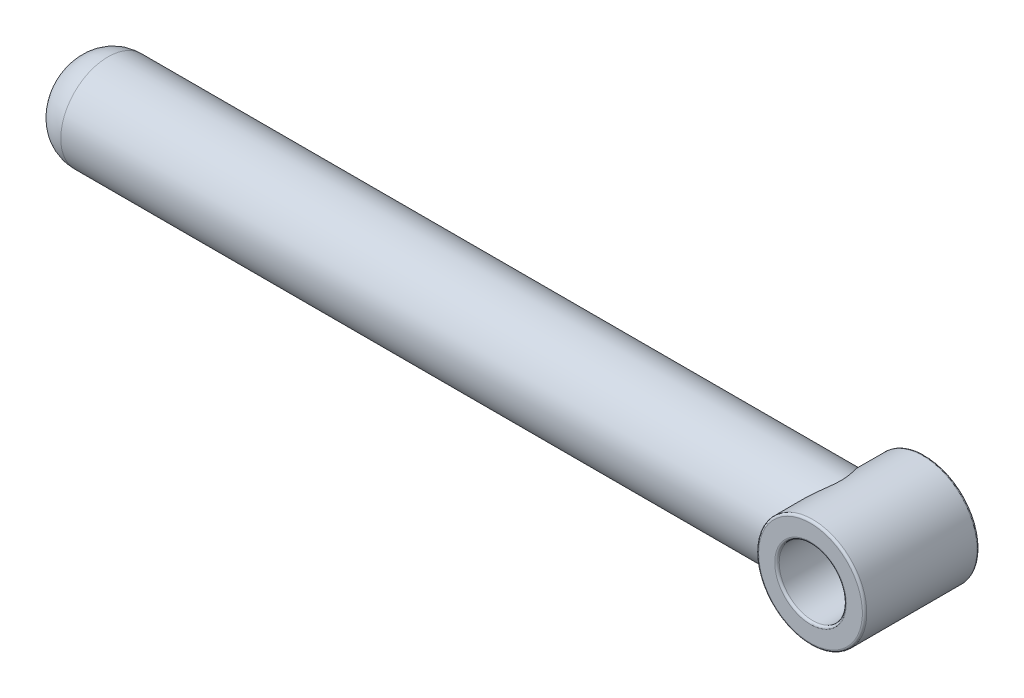
ISO-10303-21;
HEADER;
FILE_DESCRIPTION(('STEP AP214'),'2;1');
FILE_NAME('part.step','',(''),(''),'','','');
FILE_SCHEMA(('AUTOMOTIVE_DESIGN { 1 0 10303 214 1 1 1 1 }'));
ENDSEC;
DATA;
#1=APPLICATION_CONTEXT('core data for automotive mechanical design processes');
#2=APPLICATION_PROTOCOL_DEFINITION('international standard','automotive_design',2000,#1);
#3=PRODUCT_CONTEXT('',#1,'mechanical');
#4=PRODUCT('Part','Part','',(#3));
#5=PRODUCT_RELATED_PRODUCT_CATEGORY('part','',(#4));
#6=PRODUCT_DEFINITION_FORMATION('','',#4);
#7=PRODUCT_DEFINITION_CONTEXT('part definition',#1,'design');
#8=PRODUCT_DEFINITION('design','',#6,#7);
#9=PRODUCT_DEFINITION_SHAPE('','',#8);
#10=(LENGTH_UNIT() NAMED_UNIT(*) SI_UNIT(.MILLI.,.METRE.));
#11=(NAMED_UNIT(*) PLANE_ANGLE_UNIT() SI_UNIT($,.RADIAN.));
#12=(NAMED_UNIT(*) SI_UNIT($,.STERADIAN.) SOLID_ANGLE_UNIT());
#13=UNCERTAINTY_MEASURE_WITH_UNIT(LENGTH_MEASURE(1.E-05),#10,'distance_accuracy_value','');
#14=(GEOMETRIC_REPRESENTATION_CONTEXT(3) GLOBAL_UNCERTAINTY_ASSIGNED_CONTEXT((#13)) GLOBAL_UNIT_ASSIGNED_CONTEXT((#10,
#11,#12)) REPRESENTATION_CONTEXT('',''));
#15=CARTESIAN_POINT('',(0.,0.,0.));
#16=DIRECTION('',(0.,0.,1.));
#17=DIRECTION('',(1.,0.,0.));
#18=AXIS2_PLACEMENT_3D('',#15,#16,#17);
#19=CARTESIAN_POINT('',(0.,0.,25.65));
#20=DIRECTION('',(0.,0.,-1.));
#21=DIRECTION('',(1.,0.,0.));
#22=AXIS2_PLACEMENT_3D('',#19,#20,#21);
#23=CYLINDRICAL_SURFACE('',#22,15.);
#24=CARTESIAN_POINT('',(0.,0.,24.65));
#25=DIRECTION('',(0.,0.,-1.));
#26=DIRECTION('',(-1.,0.,0.));
#27=AXIS2_PLACEMENT_3D('',#24,#25,#26);
#28=CIRCLE('',#27,15.);
#29=CARTESIAN_POINT('',(15.,0.,24.65));
#30=VERTEX_POINT('',#29);
#31=CARTESIAN_POINT('',(-15.,0.,24.65));
#32=VERTEX_POINT('',#31);
#33=EDGE_CURVE('E188',#30,#32,#28,.T.);
#34=ORIENTED_EDGE('',*,*,#33,.F.);
#35=CARTESIAN_POINT('',(0.,0.,24.65));
#36=DIRECTION('',(0.,0.,-1.));
#37=DIRECTION('',(-1.,0.,0.));
#38=AXIS2_PLACEMENT_3D('',#35,#36,#37);
#39=CIRCLE('',#38,15.);
#40=EDGE_CURVE('E164',#32,#30,#39,.T.);
#41=ORIENTED_EDGE('',*,*,#40,.F.);
#42=DIRECTION('',(0.,0.,-1.));
#43=VECTOR('',#42,1.);
#44=CARTESIAN_POINT('',(-15.,0.,25.65));
#45=LINE('',#44,#43);
#46=CARTESIAN_POINT('',(-15.,0.,-24.65));
#47=VERTEX_POINT('',#46);
#48=EDGE_CURVE('E158',#32,#47,#45,.T.);
#49=ORIENTED_EDGE('',*,*,#48,.T.);
#50=CARTESIAN_POINT('',(0.,0.,-24.65));
#51=DIRECTION('',(0.,0.,1.));
#52=DIRECTION('',(-1.,0.,0.));
#53=AXIS2_PLACEMENT_3D('',#50,#51,#52);
#54=CIRCLE('',#53,15.);
#55=EDGE_CURVE('E171',#47,#47,#54,.T.);
#56=ORIENTED_EDGE('',*,*,#55,.F.);
#57=ORIENTED_EDGE('',*,*,#48,.F.);
#58=EDGE_LOOP('',(#34,#41,#49,#56,#57));
#59=FACE_BOUND('',#58,.T.);
#60=ADVANCED_FACE('F40',(#59),#23,.F.);
#61=CARTESIAN_POINT('',(0.,0.,-24.65));
#62=DIRECTION('',(0.,0.,1.));
#63=DIRECTION('',(1.,0.,0.));
#64=AXIS2_PLACEMENT_3D('',#61,#62,#63);
#65=TOROIDAL_SURFACE('',#64,16.,1.);
#66=CARTESIAN_POINT('',(0.,0.,-25.65));
#67=DIRECTION('',(0.,0.,-1.));
#68=DIRECTION('',(-1.,0.,0.));
#69=AXIS2_PLACEMENT_3D('',#66,#67,#68);
#70=CIRCLE('',#69,16.);
#71=CARTESIAN_POINT('',(-16.,0.,-25.65));
#72=VERTEX_POINT('',#71);
#73=EDGE_CURVE('E172',#72,#72,#70,.T.);
#74=ORIENTED_EDGE('',*,*,#73,.T.);
#75=CARTESIAN_POINT('',(-16.,0.,-24.65));
#76=DIRECTION('',(0.,-1.,0.));
#77=DIRECTION('',(-1.,0.,0.));
#78=AXIS2_PLACEMENT_3D('',#75,#76,#77);
#79=CIRCLE('',#78,1.);
#80=EDGE_CURVE('E168',#72,#47,#79,.T.);
#81=ORIENTED_EDGE('',*,*,#80,.T.);
#82=ORIENTED_EDGE('',*,*,#55,.T.);
#83=ORIENTED_EDGE('',*,*,#80,.F.);
#84=EDGE_LOOP('',(#74,#81,#82,#83));
#85=FACE_BOUND('',#84,.T.);
#86=ADVANCED_FACE('F212',(#85),#65,.T.);
#87=CARTESIAN_POINT('',(0.,0.,24.65));
#88=DIRECTION('',(0.,0.,-1.));
#89=DIRECTION('',(-1.,0.,0.));
#90=AXIS2_PLACEMENT_3D('',#87,#88,#89);
#91=TOROIDAL_SURFACE('',#90,16.,1.);
#92=CARTESIAN_POINT('',(0.,0.,25.65));
#93=DIRECTION('',(0.,0.,1.));
#94=DIRECTION('',(-1.,0.,0.));
#95=AXIS2_PLACEMENT_3D('',#92,#93,#94);
#96=CIRCLE('',#95,16.);
#97=CARTESIAN_POINT('',(16.,0.,25.65));
#98=VERTEX_POINT('',#97);
#99=EDGE_CURVE('E157',#98,#98,#96,.T.);
#100=ORIENTED_EDGE('',*,*,#99,.T.);
#101=CARTESIAN_POINT('',(16.,0.,24.65));
#102=DIRECTION('',(0.,-1.,0.));
#103=DIRECTION('',(1.,0.,0.));
#104=AXIS2_PLACEMENT_3D('',#101,#102,#103);
#105=CIRCLE('',#104,1.);
#106=EDGE_CURVE('E165',#98,#30,#105,.T.);
#107=ORIENTED_EDGE('',*,*,#106,.T.);
#108=ORIENTED_EDGE('',*,*,#33,.T.);
#109=ORIENTED_EDGE('',*,*,#40,.T.);
#110=ORIENTED_EDGE('',*,*,#106,.F.);
#111=EDGE_LOOP('',(#100,#107,#108,#109,#110));
#112=FACE_BOUND('',#111,.T.);
#113=ADVANCED_FACE('F218',(#112),#91,.T.);
#114=CARTESIAN_POINT('',(0.,0.,-25.65));
#115=DIRECTION('',(0.,0.,1.));
#116=DIRECTION('',(1.,0.,0.));
#117=AXIS2_PLACEMENT_3D('',#114,#115,#116);
#118=PLANE('',#117);
#119=ORIENTED_EDGE('',*,*,#73,.F.);
#120=EDGE_LOOP('',(#119));
#121=FACE_BOUND('',#120,.T.);
#122=CARTESIAN_POINT('',(0.,0.,-25.65));
#123=DIRECTION('',(0.,0.,1.));
#124=DIRECTION('',(-1.,0.,0.));
#125=AXIS2_PLACEMENT_3D('',#122,#123,#124);
#126=CIRCLE('',#125,23.19);
#127=CARTESIAN_POINT('',(23.19,0.,-25.65));
#128=VERTEX_POINT('',#127);
#129=EDGE_CURVE('E154',#128,#128,#126,.T.);
#130=ORIENTED_EDGE('',*,*,#129,.F.);
#131=EDGE_LOOP('',(#130));
#132=FACE_BOUND('',#131,.T.);
#133=ADVANCED_FACE('F226',(#121,#132),#118,.F.);
#134=CARTESIAN_POINT('',(0.,0.,25.65));
#135=DIRECTION('',(0.,0.,1.));
#136=DIRECTION('',(1.,0.,0.));
#137=AXIS2_PLACEMENT_3D('',#134,#135,#136);
#138=PLANE('',#137);
#139=ORIENTED_EDGE('',*,*,#99,.F.);
#140=EDGE_LOOP('',(#139));
#141=FACE_BOUND('',#140,.T.);
#142=CARTESIAN_POINT('',(0.,0.,25.65));
#143=DIRECTION('',(0.,0.,-1.));
#144=DIRECTION('',(-1.,0.,0.));
#145=AXIS2_PLACEMENT_3D('',#142,#143,#144);
#146=CIRCLE('',#145,23.19);
#147=CARTESIAN_POINT('',(-23.19,0.,25.65));
#148=VERTEX_POINT('',#147);
#149=EDGE_CURVE('E167',#148,#148,#146,.T.);
#150=ORIENTED_EDGE('',*,*,#149,.F.);
#151=EDGE_LOOP('',(#150));
#152=FACE_BOUND('',#151,.T.);
#153=ADVANCED_FACE('F137',(#141,#152),#138,.T.);
#154=CARTESIAN_POINT('',(0.,0.,-24.65));
#155=DIRECTION('',(0.,0.,-1.));
#156=DIRECTION('',(-1.,0.,0.));
#157=AXIS2_PLACEMENT_3D('',#154,#155,#156);
#158=TOROIDAL_SURFACE('',#157,23.19,1.);
#159=ORIENTED_EDGE('',*,*,#129,.T.);
#160=CARTESIAN_POINT('',(23.19,0.,-24.65));
#161=DIRECTION('',(0.,-1.,0.));
#162=DIRECTION('',(1.,0.,0.));
#163=AXIS2_PLACEMENT_3D('',#160,#161,#162);
#164=CIRCLE('',#163,1.);
#165=CARTESIAN_POINT('',(24.19,0.,-24.65));
#166=VERTEX_POINT('',#165);
#167=EDGE_CURVE('E144',#128,#166,#164,.T.);
#168=ORIENTED_EDGE('',*,*,#167,.T.);
#169=CARTESIAN_POINT('',(0.,0.,-24.65));
#170=DIRECTION('',(0.,0.,-1.));
#171=DIRECTION('',(-1.,0.,0.));
#172=AXIS2_PLACEMENT_3D('',#169,#170,#171);
#173=CIRCLE('',#172,24.19);
#174=CARTESIAN_POINT('',(-24.19,0.,-24.65));
#175=VERTEX_POINT('',#174);
#176=EDGE_CURVE('E148',#166,#175,#173,.T.);
#177=ORIENTED_EDGE('',*,*,#176,.T.);
#178=CARTESIAN_POINT('',(0.,0.,-24.65));
#179=DIRECTION('',(0.,0.,-1.));
#180=DIRECTION('',(-1.,0.,0.));
#181=AXIS2_PLACEMENT_3D('',#178,#179,#180);
#182=CIRCLE('',#181,24.19);
#183=EDGE_CURVE('E145',#175,#166,#182,.T.);
#184=ORIENTED_EDGE('',*,*,#183,.T.);
#185=ORIENTED_EDGE('',*,*,#167,.F.);
#186=EDGE_LOOP('',(#159,#168,#177,#184,#185));
#187=FACE_BOUND('',#186,.T.);
#188=ADVANCED_FACE('F230',(#187),#158,.T.);
#189=CARTESIAN_POINT('',(0.,0.,24.65));
#190=DIRECTION('',(0.,0.,1.));
#191=DIRECTION('',(1.,0.,0.));
#192=AXIS2_PLACEMENT_3D('',#189,#190,#191);
#193=TOROIDAL_SURFACE('',#192,23.19,1.);
#194=ORIENTED_EDGE('',*,*,#149,.T.);
#195=CARTESIAN_POINT('',(-23.19,0.,24.65));
#196=DIRECTION('',(0.,-1.,0.));
#197=DIRECTION('',(-1.,0.,0.));
#198=AXIS2_PLACEMENT_3D('',#195,#196,#197);
#199=CIRCLE('',#198,1.);
#200=CARTESIAN_POINT('',(-24.19,0.,24.65));
#201=VERTEX_POINT('',#200);
#202=EDGE_CURVE('E153',#148,#201,#199,.T.);
#203=ORIENTED_EDGE('',*,*,#202,.T.);
#204=CARTESIAN_POINT('',(0.,0.,24.65));
#205=DIRECTION('',(0.,0.,1.));
#206=DIRECTION('',(-1.,0.,0.));
#207=AXIS2_PLACEMENT_3D('',#204,#205,#206);
#208=CIRCLE('',#207,24.19);
#209=EDGE_CURVE('E118',#201,#201,#208,.T.);
#210=ORIENTED_EDGE('',*,*,#209,.T.);
#211=ORIENTED_EDGE('',*,*,#202,.F.);
#212=EDGE_LOOP('',(#194,#203,#210,#211));
#213=FACE_BOUND('',#212,.T.);
#214=ADVANCED_FACE('F136',(#213),#193,.T.);
#215=CARTESIAN_POINT('',(0.,0.,0.));
#216=DIRECTION('',(0.,0.,1.));
#217=DIRECTION('',(1.,0.,0.));
#218=AXIS2_PLACEMENT_3D('',#215,#216,#217);
#219=CYLINDRICAL_SURFACE('',#218,24.19);
#220=ORIENTED_EDGE('',*,*,#209,.F.);
#221=DIRECTION('',(0.,0.,-1.));
#222=VECTOR('',#221,1.);
#223=CARTESIAN_POINT('',(-24.19,0.,0.));
#224=LINE('',#223,#222);
#225=CARTESIAN_POINT('',(-24.19,0.,21.1));
#226=VERTEX_POINT('',#225);
#227=EDGE_CURVE('E117',#201,#226,#224,.T.);
#228=ORIENTED_EDGE('',*,*,#227,.T.);
#229=CARTESIAN_POINT('',(-24.19,0.,21.1));
#230=CARTESIAN_POINT('',(-24.1900076701048,-0.248320968132283,21.1000074174944));
#231=CARTESIAN_POINT('',(-24.1861764782467,-0.496637238632777,21.0956165045089));
#232=CARTESIAN_POINT('',(-24.1708936377932,-0.992714902971529,21.0780936738256));
#233=CARTESIAN_POINT('',(-24.1594423501102,-1.24047632253171,21.0649621701104));
#234=CARTESIAN_POINT('',(-24.1289874404954,-1.73474608541718,21.030026268484));
#235=CARTESIAN_POINT('',(-24.1099892113466,-1.98125519648686,21.0082280634877));
#236=CARTESIAN_POINT('',(-24.0645584738644,-2.47265941043764,20.9560739642434));
#237=CARTESIAN_POINT('',(-24.0381259186053,-2.71755450312103,20.9257180159787));
#238=CARTESIAN_POINT('',(-23.948363615689,-3.44518890236064,20.822564403275));
#239=CARTESIAN_POINT('',(-23.8743140231388,-3.9249505358196,20.7373889975156));
#240=CARTESIAN_POINT('',(-23.6990678789315,-4.87264768542594,20.5353897506526));
#241=CARTESIAN_POINT('',(-23.5978677486705,-5.34058163371065,20.4185617375254));
#242=CARTESIAN_POINT('',(-23.3706381072294,-6.26044674393306,20.1555204131199));
#243=CARTESIAN_POINT('',(-23.2446769348148,-6.71241800018634,20.0093879582214));
#244=CARTESIAN_POINT('',(-22.9700197322245,-7.59933283506647,19.6896521816409));
#245=CARTESIAN_POINT('',(-22.8213244176979,-8.03427694915024,19.5160497246822));
#246=CARTESIAN_POINT('',(-22.5032973905389,-8.88621532034767,19.143191629847));
#247=CARTESIAN_POINT('',(-22.3339286334588,-9.30317548867582,18.9438899046915));
#248=CARTESIAN_POINT('',(-21.9771879633171,-10.1171578243615,18.5219699419594));
#249=CARTESIAN_POINT('',(-21.7898120729567,-10.5141755573415,18.2993465522623));
#250=CARTESIAN_POINT('',(-21.324257277755,-11.4364323156889,17.7428654530749));
#251=CARTESIAN_POINT('',(-21.0389014409622,-11.9521605883574,17.3991903785285));
#252=CARTESIAN_POINT('',(-20.4444089279874,-12.9428059911423,16.6754429899315));
#253=CARTESIAN_POINT('',(-20.1352637345215,-13.4177083743507,16.2953576278975));
#254=CARTESIAN_POINT('',(-19.4985663666644,-14.3272715753217,15.5017505573226));
#255=CARTESIAN_POINT('',(-19.1709804131946,-14.7618544104225,15.0881668369539));
#256=CARTESIAN_POINT('',(-18.5038472366338,-15.5899455622577,14.230909519692));
#257=CARTESIAN_POINT('',(-18.1643016190706,-15.9834593644168,13.7872399543366));
#258=CARTESIAN_POINT('',(-17.4720315220713,-16.7377305448607,12.861660363556));
#259=CARTESIAN_POINT('',(-17.1191800774178,-17.0976241965796,12.3791420322353));
#260=CARTESIAN_POINT('',(-16.4143599649407,-17.7753752772202,11.3845678594015));
#261=CARTESIAN_POINT('',(-16.0623916085761,-18.0932194912872,10.8725028045217));
#262=CARTESIAN_POINT('',(-15.3684112431481,-18.686245335686,9.8183397851733));
#263=CARTESIAN_POINT('',(-15.0263909817822,-18.9614631963217,9.27626786300871));
#264=CARTESIAN_POINT('',(-14.5296981442599,-19.3413444030053,8.4389618916139));
#265=CARTESIAN_POINT('',(-14.3669007997345,-19.4624507578499,8.15591088026673));
#266=CARTESIAN_POINT('',(-14.0485859854916,-19.6934493179608,7.58116283971085));
#267=CARTESIAN_POINT('',(-13.8930696083871,-19.8033398430331,7.289464523509));
#268=CARTESIAN_POINT('',(-13.5781696608457,-20.0207191999087,6.67066099149476));
#269=CARTESIAN_POINT('',(-13.4196761030927,-20.1271216734422,6.34271673386055));
#270=CARTESIAN_POINT('',(-13.1176324736237,-20.3252658151019,5.67578344350614));
#271=CARTESIAN_POINT('',(-12.9740769930655,-20.4170127962348,5.33679846724037));
#272=CARTESIAN_POINT('',(-12.7067939063027,-20.5844173058153,4.64932856778054));
#273=CARTESIAN_POINT('',(-12.5829652425833,-20.660157533051,4.30090351800552));
#274=CARTESIAN_POINT('',(-12.3590388411187,-20.7948883871331,3.59334552088489));
#275=CARTESIAN_POINT('',(-12.2589310059437,-20.8538861429988,3.23421720323808));
#276=CARTESIAN_POINT('',(-12.1183119928582,-20.9357741577232,2.63790056974152));
#277=CARTESIAN_POINT('',(-12.0693260926978,-20.964013891291,2.40342347508946));
#278=CARTESIAN_POINT('',(-11.9842581356231,-21.0127592800554,1.93137918854403));
#279=CARTESIAN_POINT('',(-11.9481725670612,-21.0332670400846,1.69381285586061));
#280=CARTESIAN_POINT('',(-11.8896384898135,-21.0664142579288,1.21425144041929));
#281=CARTESIAN_POINT('',(-11.8673164097513,-21.0789807946837,0.972235734233318));
#282=CARTESIAN_POINT('',(-11.8373932556302,-21.0957881947916,0.486825990604983));
#283=CARTESIAN_POINT('',(-11.8298035708275,-21.1000226168242,0.243431032556692));
#284=CARTESIAN_POINT('',(-11.8298816562128,-21.1,0.));
#285=B_SPLINE_CURVE_WITH_KNOTS('',3,(#229,#230,#231,#232,#233,#234,#235,#236,#237,#238,#239,
#240,#241,#242,#243,#244,#245,#246,#247,#248,#249,#250,#251,#252,#253,#254,#255,#256,#257,#258,
#259,#260,#261,#262,#263,#264,#265,#266,#267,#268,#269,#270,#271,#272,#273,#274,#275,#276,#277,
#278,#279,#280,#281,#282,#283,#284),.UNSPECIFIED.,.F.,.F.,(4,2,2,2,2,2,2,2,2,2,2,2,2,2,2,2,2,2,
2,2,2,2,2,2,2,2,2,4),(0.,0.744886193736472,1.4897371097654,2.23405673577629,2.97838106005382,
4.45480094341388,5.9314155234577,7.40401056254295,8.87655925529222,10.3517864288871,
11.8273401932679,13.8712148347762,15.9158246784911,17.9643100066432,20.0125213757813,
22.1038408208869,24.1958159504495,26.2860031293403,27.3305023728023,28.3751578591476,
29.5128906002318,30.6502099421768,31.7815013515561,32.9123103267042,33.6354776414684,
34.358447949983,35.0879640606083,35.8180439181232),.UNSPECIFIED.);
#286=CARTESIAN_POINT('',(-11.8298816562128,-21.1,0.));
#287=VERTEX_POINT('',#286);
#288=EDGE_CURVE('E103',#226,#287,#285,.T.);
#289=ORIENTED_EDGE('',*,*,#288,.T.);
#290=CARTESIAN_POINT('',(-11.8298816562128,-21.1,0.));
#291=CARTESIAN_POINT('',(-11.8298677813332,-21.1000033989896,-0.17293605594265));
#292=CARTESIAN_POINT('',(-11.8336758390667,-21.0978732141805,-0.345841823355138));
#293=CARTESIAN_POINT('',(-11.848803683265,-21.0893827255771,-0.691190616769087));
#294=CARTESIAN_POINT('',(-11.8601221404638,-21.0830231703389,-0.863633719235866));
#295=CARTESIAN_POINT('',(-11.9050713794334,-21.0576974870929,-1.37889064724477));
#296=CARTESIAN_POINT('',(-11.9496973771575,-21.0324839358711,-1.7205073976675));
#297=CARTESIAN_POINT('',(-12.0647949874141,-20.9666655831007,-2.39184798807697));
#298=CARTESIAN_POINT('',(-12.134827796819,-20.926321720971,-2.72167506046684));
#299=CARTESIAN_POINT('',(-12.2974912197511,-20.8311469218922,-3.37371767687989));
#300=CARTESIAN_POINT('',(-12.3901364665806,-20.7763066018603,-3.69592814323166));
#301=CARTESIAN_POINT('',(-12.6402759596416,-20.6254525179716,-4.4744777592874));
#302=CARTESIAN_POINT('',(-12.8082028322725,-20.52201091161,-4.92602189286902));
#303=CARTESIAN_POINT('',(-13.1734965103912,-20.2894543799745,-5.81009942665675));
#304=CARTESIAN_POINT('',(-13.3708772857459,-20.160327262436,-6.24262367909176));
#305=CARTESIAN_POINT('',(-13.7884830816303,-19.8770746281644,-7.0932852279874));
#306=CARTESIAN_POINT('',(-14.0089025362996,-19.7227289090519,-7.51125242177561));
#307=CARTESIAN_POINT('',(-14.4642666963267,-19.3912460085883,-8.32973764019114));
#308=CARTESIAN_POINT('',(-14.699210578204,-19.2141101187398,-8.73025665187417));
#309=CARTESIAN_POINT('',(-15.1275768903385,-18.8777694912776,-9.43171634511264));
#310=CARTESIAN_POINT('',(-15.3192326161982,-18.7227343201866,-9.73575469132363));
#311=CARTESIAN_POINT('',(-15.7063204202098,-18.3992195454616,-10.3341367183184));
#312=CARTESIAN_POINT('',(-15.9017528750649,-18.2307385954018,-10.6284794240257));
#313=CARTESIAN_POINT('',(-16.4911999990432,-17.7051758009339,-11.4976393630295));
#314=CARTESIAN_POINT('',(-16.8882718000003,-17.3280454856964,-12.0584399493888));
#315=CARTESIAN_POINT('',(-17.6778888817611,-16.5216950663067,-13.1414622031544));
#316=CARTESIAN_POINT('',(-18.0704432606128,-16.0926132373122,-13.6637805775774));
#317=CARTESIAN_POINT('',(-18.8426477444112,-15.1811475315845,-14.6698017519765));
#318=CARTESIAN_POINT('',(-19.2223035080669,-14.6987874337587,-15.1535216143486));
#319=CARTESIAN_POINT('',(-19.8754783600573,-13.7969759434857,-15.9729363260533));
#320=CARTESIAN_POINT('',(-20.1533884037625,-13.3884251329035,-16.3171569239837));
#321=CARTESIAN_POINT('',(-20.6923702608565,-12.5393283199989,-16.9783623073685));
#322=CARTESIAN_POINT('',(-20.9534424269593,-12.0987829882977,-17.2953476633835));
#323=CARTESIAN_POINT('',(-21.4543684652926,-11.1864478629128,-17.8989419976337));
#324=CARTESIAN_POINT('',(-21.6942416020075,-10.7146871323348,-18.1855786030193));
#325=CARTESIAN_POINT('',(-22.0349698071709,-9.98440803620929,-18.5902950239187));
#326=CARTESIAN_POINT('',(-22.1453603398835,-9.73722221902826,-18.7209878945879));
#327=CARTESIAN_POINT('',(-22.3592921241855,-9.23539776495859,-18.9735699480172));
#328=CARTESIAN_POINT('',(-22.4628316000655,-8.98075722037373,-19.095456849125));
#329=CARTESIAN_POINT('',(-22.725159355381,-8.30218271283175,-19.4035253149342));
#330=CARTESIAN_POINT('',(-22.8778239401849,-7.87232972171538,-19.582030743482));
#331=CARTESIAN_POINT('',(-23.1610063681852,-6.99543755652182,-19.9121396638572));
#332=CARTESIAN_POINT('',(-23.2915286255309,-6.54840182972915,-20.0637485178856));
#333=CARTESIAN_POINT('',(-23.5280142010858,-5.63990446681989,-20.3378008397087));
#334=CARTESIAN_POINT('',(-23.6340164194985,-5.17846701718865,-20.4602905127665));
#335=CARTESIAN_POINT('',(-23.8196592615988,-4.24347887091229,-20.6744507122564));
#336=CARTESIAN_POINT('',(-23.8993090696808,-3.76993245662639,-20.7661319762713));
#337=CARTESIAN_POINT('',(-24.0392292230967,-2.75117450842477,-20.9270219489708));
#338=CARTESIAN_POINT('',(-24.0956047740885,-2.20468735713774,-20.9917258700262));
#339=CARTESIAN_POINT('',(-24.1521502118418,-1.38052910729905,-21.0565988252452));
#340=CARTESIAN_POINT('',(-24.1663291144527,-1.10493152235243,-21.072859391513));
#341=CARTESIAN_POINT('',(-24.1852579188503,-0.552907847177669,-21.0945636816625));
#342=CARTESIAN_POINT('',(-24.1900050801122,-0.27648153951208,-21.1000042616458));
#343=CARTESIAN_POINT('',(-24.19,0.,-21.1));
#344=B_SPLINE_CURVE_WITH_KNOTS('',3,(#290,#291,#292,#293,#294,#295,#296,#297,#298,#299,#300,
#301,#302,#303,#304,#305,#306,#307,#308,#309,#310,#311,#312,#313,#314,#315,#316,#317,#318,#319,
#320,#321,#322,#323,#324,#325,#326,#327,#328,#329,#330,#331,#332,#333,#334,#335,#336,#337,#338,
#339,#340,#341,#342,#343),.UNSPECIFIED.,.F.,.F.,(4,2,2,2,2,2,2,2,2,2,2,2,2,2,2,2,2,2,2,2,2,2,2,
2,2,2,4),(0.,0.518695039396557,1.03729829941226,2.07189067909151,3.08940467026575,
4.10757888449907,5.58331210736701,7.05974750240087,8.54984094522286,10.0398499826737,
11.2137224857602,12.3877126852833,14.7362583493367,17.0786850942804,19.4200705708035,
21.2251124132699,23.0301164320641,24.8334629260575,25.7350416736557,26.6368531913309,
28.1048290468047,29.5725119114664,31.0378501289383,32.5026771045194,34.1590036592575,
34.9880043576459,35.8172458986145),.UNSPECIFIED.);
#345=CARTESIAN_POINT('',(-24.19,0.,-21.1));
#346=VERTEX_POINT('',#345);
#347=EDGE_CURVE('E108',#287,#346,#344,.T.);
#348=ORIENTED_EDGE('',*,*,#347,.T.);
#349=DIRECTION('',(0.,0.,-1.));
#350=VECTOR('',#349,1.);
#351=CARTESIAN_POINT('',(-24.19,0.,0.));
#352=LINE('',#351,#350);
#353=EDGE_CURVE('E113',#346,#175,#352,.T.);
#354=ORIENTED_EDGE('',*,*,#353,.T.);
#355=ORIENTED_EDGE('',*,*,#176,.F.);
#356=ORIENTED_EDGE('',*,*,#183,.F.);
#357=ORIENTED_EDGE('',*,*,#353,.F.);
#358=CARTESIAN_POINT('',(-24.19,0.,-21.1));
#359=CARTESIAN_POINT('',(-24.1900076699201,0.248319560168318,-21.1000074173147));
#360=CARTESIAN_POINT('',(-24.186176521598,0.496634422757893,-21.09561655421));
#361=CARTESIAN_POINT('',(-24.1708938543475,0.992709280071767,-21.0780939221364));
#362=CARTESIAN_POINT('',(-24.1594426963424,1.24046930051861,-21.0649625671627));
#363=CARTESIAN_POINT('',(-24.1289881304707,1.73473628953567,-21.0300270600966));
#364=CARTESIAN_POINT('',(-24.1099901151727,1.98124402581527,-21.008229100673));
#365=CARTESIAN_POINT('',(-24.064559887255,2.47264551749832,-20.9560755871968));
#366=CARTESIAN_POINT('',(-24.0381276276882,2.71753926269947,-20.9257199791029));
#367=CARTESIAN_POINT('',(-23.9483656469357,3.4451751820804,-20.8225667394668));
#368=CARTESIAN_POINT('',(-23.8743158697781,3.92493964417245,-20.737391123974));
#369=CARTESIAN_POINT('',(-23.699069035402,4.87264233761541,-20.5353910857515));
#370=CARTESIAN_POINT('',(-23.597868399171,5.34057900092714,-20.4185624905218));
#371=CARTESIAN_POINT('',(-23.370635898227,6.26045568580512,-20.1555178559996));
#372=CARTESIAN_POINT('',(-23.2446720292343,6.7124356004087,-20.0093822672054));
#373=CARTESIAN_POINT('',(-22.9700085892906,7.59936705769644,-19.6896391901582));
#374=CARTESIAN_POINT('',(-22.821309733566,8.03431913552367,-19.5160325661183));
#375=CARTESIAN_POINT('',(-22.5032811147798,8.88625606458783,-19.1431724905859));
#376=CARTESIAN_POINT('',(-22.3339151002626,9.30320755646888,-18.943873938321));
#377=CARTESIAN_POINT('',(-21.9771806653423,10.1171732867046,-18.5219612711661));
#378=CARTESIAN_POINT('',(-21.7898082687395,10.514183091895,-18.2993420055746));
#379=CARTESIAN_POINT('',(-21.3242863999059,11.4363746272986,-17.7429002622759));
#380=CARTESIAN_POINT('',(-21.0389629255826,11.9520494707188,-17.3992644253564));
#381=CARTESIAN_POINT('',(-20.4445395593145,12.9425969767929,-16.6756028295984));
#382=CARTESIAN_POINT('',(-20.1354311480993,13.4174548895277,-16.2955640199246));
#383=CARTESIAN_POINT('',(-19.4987413442303,14.3270359507646,-15.5019709424314));
#384=CARTESIAN_POINT('',(-19.1711223309774,14.7616722546794,-15.0883476140404));
#385=CARTESIAN_POINT('',(-18.5039200419049,15.5898611864394,-14.2310046598594));
#386=CARTESIAN_POINT('',(-18.1643383781163,15.9834193216765,-13.7872890817618));
#387=CARTESIAN_POINT('',(-17.4718309830131,16.7379490358931,-12.8613922592649));
#388=CARTESIAN_POINT('',(-17.1187753543855,17.0980369659857,-12.3785886740157));
#389=CARTESIAN_POINT('',(-16.4135506851954,17.7761298405106,-11.3834080785417));
#390=CARTESIAN_POINT('',(-16.0613819619954,18.0941213766127,-10.8710217200347));
#391=CARTESIAN_POINT('',(-15.367420735008,18.6870526601496,-9.81678235367161));
#392=CARTESIAN_POINT('',(-15.0256089116457,18.9620771265089,-9.27499024366114));
#393=CARTESIAN_POINT('',(-14.5291940253981,19.3417220231419,-8.43809176029717));
#394=CARTESIAN_POINT('',(-14.3664726970171,19.4627659141148,-8.15515383475503));
#395=CARTESIAN_POINT('',(-14.0483542321675,19.6936130121338,-7.58072838952777));
#396=CARTESIAN_POINT('',(-13.8929558745613,19.8034180969047,-7.28924230853055));
#397=CARTESIAN_POINT('',(-13.5866145722761,20.0148898390796,-6.68725459208633));
#398=CARTESIAN_POINT('',(-13.4360005568587,20.1161551368075,-6.37644327405292));
#399=CARTESIAN_POINT('',(-13.1479721528785,20.3055815280576,-5.74474499285037));
#400=CARTESIAN_POINT('',(-13.0105598840958,20.3937405183641,-5.42385642253459));
#401=CARTESIAN_POINT('',(-12.752732215569,20.5559503254921,-4.77235954619644));
#402=CARTESIAN_POINT('',(-12.6322917454914,20.6300220095619,-4.4417664672133));
#403=CARTESIAN_POINT('',(-12.4122998185651,20.7631275851348,-3.77085593703137));
#404=CARTESIAN_POINT('',(-12.3127360231401,20.8221703634938,-3.43054436558759));
#405=CARTESIAN_POINT('',(-12.1519252720319,20.9163607041467,-2.79342679384582));
#406=CARTESIAN_POINT('',(-12.0871573642889,20.9537740851178,-2.49784915188203));
#407=CARTESIAN_POINT('',(-11.9781651923214,21.0162705927776,-1.90162237855636));
#408=CARTESIAN_POINT('',(-11.9339384636552,21.0413551986403,-1.60097386006391));
#409=CARTESIAN_POINT('',(-11.8680084339911,21.0786130330054,-0.996770614560737));
#410=CARTESIAN_POINT('',(-11.8462771380001,21.0908023098329,-0.693219975360222));
#411=CARTESIAN_POINT('',(-11.8262843689654,21.1020197318486,-0.0850911186935076));
#412=CARTESIAN_POINT('',(-11.8280229216974,21.1010478625826,0.219487099900855));
#413=CARTESIAN_POINT('',(-11.854878127862,21.0859714429577,0.827127501461219));
#414=CARTESIAN_POINT('',(-11.8799839900852,21.071872954575,1.13019031930539));
#415=CARTESIAN_POINT('',(-11.9523644952589,21.0309008938941,1.73275122167369));
#416=CARTESIAN_POINT('',(-11.999639738303,21.0040269757831,2.03224920947791));
#417=CARTESIAN_POINT('',(-12.1144126834216,20.9380387306939,2.6264120311038));
#418=CARTESIAN_POINT('',(-12.1819414557182,20.8989055931476,2.92106870018128));
#419=CARTESIAN_POINT('',(-12.3347047175343,20.8091087498842,3.50400247472556));
#420=CARTESIAN_POINT('',(-12.4199454528077,20.7584409761144,3.79227728997845));
#421=CARTESIAN_POINT('',(-12.6628309169475,20.6116344100044,4.53772919705513));
#422=CARTESIAN_POINT('',(-12.8326726507009,20.5067422173572,4.98922761544749));
#423=CARTESIAN_POINT('',(-13.2014870281812,20.2712779639535,5.87323391536138));
#424=CARTESIAN_POINT('',(-13.4004794305718,20.140688464488,6.30572865542834));
#425=CARTESIAN_POINT('',(-13.8198282720723,19.8553019532171,7.15386838971866));
#426=CARTESIAN_POINT('',(-14.0402564745195,19.7004224832345,7.56944968169202));
#427=CARTESIAN_POINT('',(-14.4952550162177,19.3680940486252,8.38332487347947));
#428=CARTESIAN_POINT('',(-14.7298238219335,19.1906475290664,8.78162063986401));
#429=CARTESIAN_POINT('',(-15.1579856863794,18.8533699555277,9.48038871835155));
#430=CARTESIAN_POINT('',(-15.3498818224737,18.6976228281009,9.78389053786366));
#431=CARTESIAN_POINT('',(-15.7373500678663,18.3726943193719,10.3812176092325));
#432=CARTESIAN_POINT('',(-15.9329225351789,18.2035116244385,10.6750419109095));
#433=CARTESIAN_POINT('',(-16.5226693670554,17.6758443734373,11.5426726765797));
#434=CARTESIAN_POINT('',(-16.9197740912445,17.2973173544129,12.10247870071));
#435=CARTESIAN_POINT('',(-17.7097994333101,16.4875466660132,13.1843353329464));
#436=CARTESIAN_POINT('',(-18.1027240609482,16.0563596348626,13.7064255604758));
#437=CARTESIAN_POINT('',(-18.8753766921523,15.1405066320834,14.7117998483466));
#438=CARTESIAN_POINT('',(-19.2551105561664,14.6558648197294,15.1951012703205));
#439=CARTESIAN_POINT('',(-19.9070238719269,13.751405014141,16.0121526286516));
#440=CARTESIAN_POINT('',(-20.1837113957034,13.3426466742715,16.3545790292956));
#441=CARTESIAN_POINT('',(-20.7201818352637,12.4932957035933,17.0122320476942));
#442=CARTESIAN_POINT('',(-20.9799651439638,12.0527038132167,17.327459297713));
#443=CARTESIAN_POINT('',(-21.4781991816041,11.1405857942434,17.9274881281264));
#444=CARTESIAN_POINT('',(-21.7166754068889,10.6690978404939,18.2123261541408));
#445=CARTESIAN_POINT('',(-22.0553097743809,9.93938425686109,18.6143972581576));
#446=CARTESIAN_POINT('',(-22.1650027220726,9.69241280737837,18.7442172408745));
#447=CARTESIAN_POINT('',(-22.3775435422363,9.1910713069546,18.9950729976817));
#448=CARTESIAN_POINT('',(-22.4803896382682,8.93669936033845,19.1161064928177));
#449=CARTESIAN_POINT('',(-22.741157520079,8.2582516455478,19.4222564306435));
#450=CARTESIAN_POINT('',(-22.8929322369888,7.82827357834082,19.5996771057986));
#451=CARTESIAN_POINT('',(-23.1743073524044,6.95123374147189,19.9276066787919));
#452=CARTESIAN_POINT('',(-23.3039121569969,6.50417538803217,20.078120924329));
#453=CARTESIAN_POINT('',(-23.538556836262,5.59572128198523,20.3499943098107));
#454=CARTESIAN_POINT('',(-23.6436341839331,5.13434863695016,20.4713979327423));
#455=CARTESIAN_POINT('',(-23.8274261751509,4.19961238476707,20.6833973117765));
#456=CARTESIAN_POINT('',(-23.9061501358452,3.72625307926156,20.7740039562174));
#457=CARTESIAN_POINT('',(-24.0432211987432,2.71465449390259,20.931605204027));
#458=CARTESIAN_POINT('',(-24.0981106565766,2.17529922738754,20.9946016203779));
#459=CARTESIAN_POINT('',(-24.1531584048476,1.36203326121146,21.057755110419));
#460=CARTESIAN_POINT('',(-24.166959974831,1.09011546478041,21.073582809454));
#461=CARTESIAN_POINT('',(-24.1853845211894,0.545482820895269,21.0947088118026));
#462=CARTESIAN_POINT('',(-24.1900048542728,0.272767766534246,21.1000040828151));
#463=CARTESIAN_POINT('',(-24.19,0.,21.1));
#464=B_SPLINE_CURVE_WITH_KNOTS('',3,(#358,#359,#360,#361,#362,#363,#364,#365,#366,#367,#368,
#369,#370,#371,#372,#373,#374,#375,#376,#377,#378,#379,#380,#381,#382,#383,#384,#385,#386,#387,
#388,#389,#390,#391,#392,#393,#394,#395,#396,#397,#398,#399,#400,#401,#402,#403,#404,#405,#406,
#407,#408,#409,#410,#411,#412,#413,#414,#415,#416,#417,#418,#419,#420,#421,#422,#423,#424,#425,
#426,#427,#428,#429,#430,#431,#432,#433,#434,#435,#436,#437,#438,#439,#440,#441,#442,#443,#444,
#445,#446,#447,#448,#449,#450,#451,#452,#453,#454,#455,#456,#457,#458,#459,#460,#461,#462,#463),
.UNSPECIFIED.,.F.,.F.,(4,2,2,2,2,2,2,2,2,2,2,2,2,2,2,2,2,2,2,2,2,2,2,2,2,2,2,2,2,2,2,2,2,2,2,2,
2,2,2,2,2,2,2,2,2,2,2,2,2,2,2,2,4),(0.,0.744881971086441,1.48972866320495,2.23404408349171,
2.97836420421435,4.45479249891556,5.9314155113584,7.40403921064132,8.8766165917662,
10.3518151297218,11.8273401753396,13.8709947188353,15.9153846951643,17.9640905718505,
20.0125214226812,22.105039689159,24.1982228585133,26.2872253070531,27.331278699234,
28.3751573703662,29.4543751401827,30.5337659094042,31.6115451282446,32.6886855489952,
33.6024850733713,34.5161749356953,35.4287263622597,36.3412787910262,37.253410004809,
38.1655659101103,39.0791283416305,39.9930134702444,41.4714903871591,42.9509741100227,
44.4355935795354,45.9200523320794,47.0938784718841,48.267819521428,50.6163053400265,
52.9622871403358,55.3072129685316,57.1079194573244,58.9085840760861,60.7070643005774,
61.6062114148853,62.5055909141799,63.9718827844358,65.43788290188,66.9016283894485,
68.3648558270291,69.99912620133,70.8169996754045,71.63510858236),.UNSPECIFIED.);
#465=EDGE_CURVE('E109',#346,#226,#464,.T.);
#466=ORIENTED_EDGE('',*,*,#465,.T.);
#467=ORIENTED_EDGE('',*,*,#227,.F.);
#468=EDGE_LOOP('',(#220,#228,#289,#348,#354,#355,#356,#357,#466,#467));
#469=FACE_BOUND('',#468,.T.);
#470=ADVANCED_FACE('F116',(#469),#219,.T.);
#471=CARTESIAN_POINT('',(0.,0.,0.));
#472=DIRECTION('',(-1.,0.,0.));
#473=DIRECTION('',(0.,1.,0.));
#474=AXIS2_PLACEMENT_3D('',#471,#472,#473);
#475=CYLINDRICAL_SURFACE('',#474,21.1);
#476=CARTESIAN_POINT('',(-339.81,0.,0.));
#477=DIRECTION('',(-1.,0.,0.));
#478=DIRECTION('',(0.,-1.,0.));
#479=AXIS2_PLACEMENT_3D('',#476,#477,#478);
#480=CIRCLE('',#479,21.1);
#481=CARTESIAN_POINT('',(-339.81,-21.1,0.));
#482=VERTEX_POINT('',#481);
#483=CARTESIAN_POINT('',(-339.81,0.,-21.1));
#484=VERTEX_POINT('',#483);
#485=EDGE_CURVE('E49',#482,#484,#480,.T.);
#486=ORIENTED_EDGE('',*,*,#485,.F.);
#487=DIRECTION('',(1.,0.,0.));
#488=VECTOR('',#487,1.);
#489=CARTESIAN_POINT('',(0.,-21.1,0.));
#490=LINE('',#489,#488);
#491=EDGE_CURVE('E11',#482,#287,#490,.T.);
#492=ORIENTED_EDGE('',*,*,#491,.T.);
#493=ORIENTED_EDGE('',*,*,#288,.F.);
#494=ORIENTED_EDGE('',*,*,#465,.F.);
#495=ORIENTED_EDGE('',*,*,#347,.F.);
#496=ORIENTED_EDGE('',*,*,#491,.F.);
#497=CARTESIAN_POINT('',(-339.81,0.,0.));
#498=DIRECTION('',(-1.,0.,0.));
#499=DIRECTION('',(0.,-1.,0.));
#500=AXIS2_PLACEMENT_3D('',#497,#498,#499);
#501=CIRCLE('',#500,21.1);
#502=EDGE_CURVE('E161',#484,#482,#501,.T.);
#503=ORIENTED_EDGE('',*,*,#502,.F.);
#504=EDGE_LOOP('',(#486,#492,#493,#494,#495,#496,#503));
#505=FACE_BOUND('',#504,.T.);
#506=ADVANCED_FACE('F101',(#505),#475,.T.);
#507=CARTESIAN_POINT('',(-339.81,0.,0.));
#508=DIRECTION('',(-1.,0.,0.));
#509=DIRECTION('',(0.,0.,1.));
#510=AXIS2_PLACEMENT_3D('',#507,#508,#509);
#511=DEGENERATE_TOROIDAL_SURFACE('',#510,5.10000000000001,16.,.T.);
#512=CARTESIAN_POINT('',(-339.81,0.,-5.1));
#513=DIRECTION('',(0.,-1.,0.));
#514=DIRECTION('',(0.,0.,-1.));
#515=AXIS2_PLACEMENT_3D('',#512,#513,#514);
#516=CIRCLE('',#515,16.);
#517=CARTESIAN_POINT('',(-353.882256120097,0.,-12.7139088312377));
#518=VERTEX_POINT('',#517);
#519=EDGE_CURVE('E159',#518,#484,#516,.T.);
#520=ORIENTED_EDGE('',*,*,#519,.F.);
#521=CARTESIAN_POINT('',(-353.882256120097,0.,0.));
#522=DIRECTION('',(1.,0.,0.));
#523=DIRECTION('',(0.,0.,-1.));
#524=AXIS2_PLACEMENT_3D('',#521,#522,#523);
#525=CIRCLE('',#524,12.7139088312377);
#526=EDGE_CURVE('E44',#518,#518,#525,.T.);
#527=ORIENTED_EDGE('',*,*,#526,.T.);
#528=ORIENTED_EDGE('',*,*,#519,.T.);
#529=ORIENTED_EDGE('',*,*,#502,.T.);
#530=ORIENTED_EDGE('',*,*,#485,.T.);
#531=EDGE_LOOP('',(#520,#527,#528,#529,#530));
#532=FACE_BOUND('',#531,.T.);
#533=ADVANCED_FACE('F42',(#532),#511,.T.);
#534=CARTESIAN_POINT('',(-353.882256120097,26.8304605634607,-44.));
#535=DIRECTION('',(1.,0.,0.));
#536=DIRECTION('',(0.,0.,-1.));
#537=AXIS2_PLACEMENT_3D('',#534,#535,#536);
#538=PLANE('',#537);
#539=CARTESIAN_POINT('',(-353.882256120097,0.,0.));
#540=DIRECTION('',(-1.,0.,0.));
#541=DIRECTION('',(0.,0.,1.));
#542=AXIS2_PLACEMENT_3D('',#539,#540,#541);
#543=CIRCLE('',#542,6.);
#544=CARTESIAN_POINT('',(-353.882256120097,0.,6.));
#545=VERTEX_POINT('',#544);
#546=EDGE_CURVE('E193',#545,#545,#543,.T.);
#547=ORIENTED_EDGE('',*,*,#546,.F.);
#548=EDGE_LOOP('',(#547));
#549=FACE_BOUND('',#548,.T.);
#550=ORIENTED_EDGE('',*,*,#526,.F.);
#551=EDGE_LOOP('',(#550));
#552=FACE_BOUND('',#551,.T.);
#553=ADVANCED_FACE('F203',(#549,#552),#538,.F.);
#554=CARTESIAN_POINT('',(-253.882256120097,0.,0.));
#555=DIRECTION('',(-1.,0.,0.));
#556=DIRECTION('',(0.,0.,1.));
#557=AXIS2_PLACEMENT_3D('',#554,#555,#556);
#558=CYLINDRICAL_SURFACE('',#557,6.);
#559=CARTESIAN_POINT('',(-253.882256120097,0.,0.));
#560=DIRECTION('',(-1.,0.,0.));
#561=DIRECTION('',(0.,0.,1.));
#562=AXIS2_PLACEMENT_3D('',#559,#560,#561);
#563=CIRCLE('',#562,6.);
#564=CARTESIAN_POINT('',(-253.882256120097,0.,6.));
#565=VERTEX_POINT('',#564);
#566=EDGE_CURVE('E196',#565,#565,#563,.T.);
#567=ORIENTED_EDGE('',*,*,#566,.F.);
#568=EDGE_LOOP('',(#567));
#569=FACE_BOUND('',#568,.T.);
#570=ORIENTED_EDGE('',*,*,#546,.T.);
#571=EDGE_LOOP('',(#570));
#572=FACE_BOUND('',#571,.T.);
#573=ADVANCED_FACE('F208',(#569,#572),#558,.F.);
#574=CARTESIAN_POINT('',(-253.882256120097,0.,0.));
#575=DIRECTION('',(-1.,0.,0.));
#576=DIRECTION('',(0.,0.,1.));
#577=AXIS2_PLACEMENT_3D('',#574,#575,#576);
#578=PLANE('',#577);
#579=ORIENTED_EDGE('',*,*,#566,.T.);
#580=EDGE_LOOP('',(#579));
#581=FACE_BOUND('',#580,.T.);
#582=ADVANCED_FACE('F311',(#581),#578,.T.);
#583=CLOSED_SHELL('',(#60,#86,#113,#133,#153,#188,#214,#470,#506,#533,#553,#573,#582));
#584=MANIFOLD_SOLID_BREP('B2',#583);
#585=ADVANCED_BREP_SHAPE_REPRESENTATION('',(#18,#584),#14);
#586=SHAPE_DEFINITION_REPRESENTATION(#9,#585);
ENDSEC;
END-ISO-10303-21;
